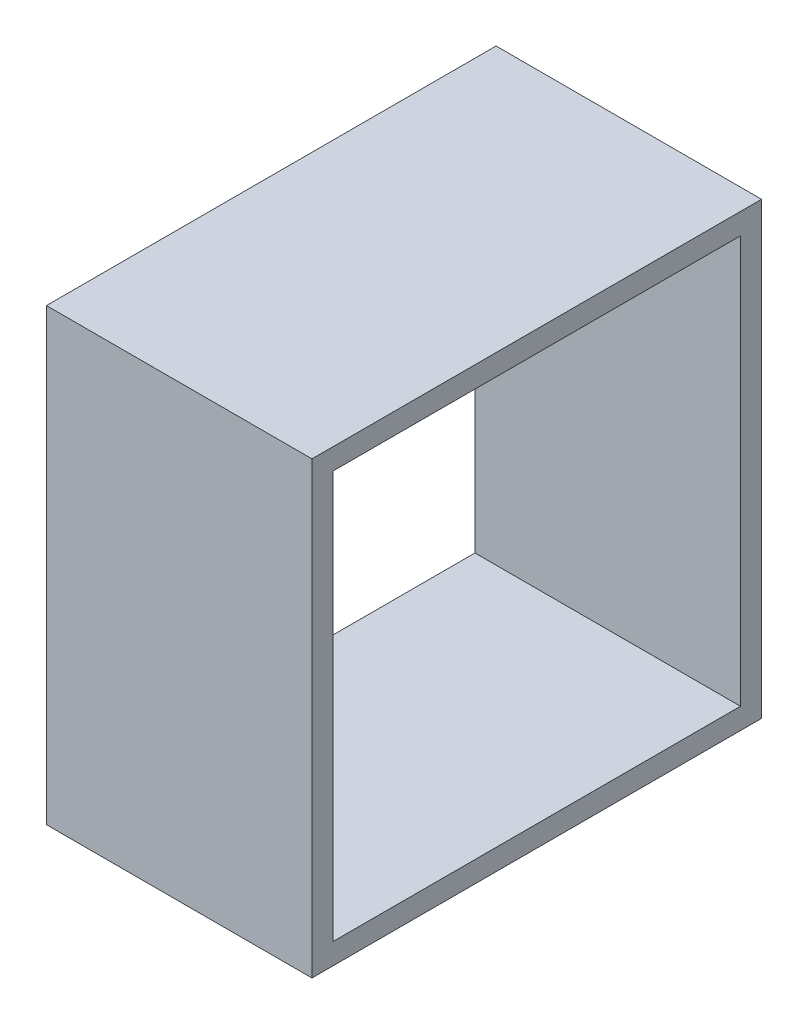
ISO-10303-21;
HEADER;
FILE_DESCRIPTION(('STEP AP214'),'2;1');
FILE_NAME('part.step','',(''),(''),'','','');
FILE_SCHEMA(('AUTOMOTIVE_DESIGN { 1 0 10303 214 1 1 1 1 }'));
ENDSEC;
DATA;
#1=APPLICATION_CONTEXT('core data for automotive mechanical design processes');
#2=APPLICATION_PROTOCOL_DEFINITION('international standard','automotive_design',2000,#1);
#3=PRODUCT_CONTEXT('',#1,'mechanical');
#4=PRODUCT('Part','Part','',(#3));
#5=PRODUCT_RELATED_PRODUCT_CATEGORY('part','',(#4));
#6=PRODUCT_DEFINITION_FORMATION('','',#4);
#7=PRODUCT_DEFINITION_CONTEXT('part definition',#1,'design');
#8=PRODUCT_DEFINITION('design','',#6,#7);
#9=PRODUCT_DEFINITION_SHAPE('','',#8);
#10=(LENGTH_UNIT() NAMED_UNIT(*) SI_UNIT(.MILLI.,.METRE.));
#11=(NAMED_UNIT(*) PLANE_ANGLE_UNIT() SI_UNIT($,.RADIAN.));
#12=(NAMED_UNIT(*) SI_UNIT($,.STERADIAN.) SOLID_ANGLE_UNIT());
#13=UNCERTAINTY_MEASURE_WITH_UNIT(LENGTH_MEASURE(1.E-05),#10,'distance_accuracy_value','');
#14=(GEOMETRIC_REPRESENTATION_CONTEXT(3) GLOBAL_UNCERTAINTY_ASSIGNED_CONTEXT((#13)) GLOBAL_UNIT_ASSIGNED_CONTEXT((#10,
#11,#12)) REPRESENTATION_CONTEXT('',''));
#15=CARTESIAN_POINT('',(0.,0.,0.));
#16=DIRECTION('',(0.,0.,1.));
#17=DIRECTION('',(1.,0.,0.));
#18=AXIS2_PLACEMENT_3D('',#15,#16,#17);
#19=CARTESIAN_POINT('',(60.,50.8,50.8));
#20=DIRECTION('',(0.,-1.,0.));
#21=DIRECTION('',(0.,0.,-1.));
#22=AXIS2_PLACEMENT_3D('',#19,#20,#21);
#23=PLANE('',#22);
#24=DIRECTION('',(0.,0.,1.));
#25=VECTOR('',#24,1.);
#26=CARTESIAN_POINT('',(0.,50.8,50.8));
#27=LINE('',#26,#25);
#28=CARTESIAN_POINT('',(0.,50.8,-50.8));
#29=VERTEX_POINT('',#28);
#30=CARTESIAN_POINT('',(0.,50.8,50.8));
#31=VERTEX_POINT('',#30);
#32=EDGE_CURVE('E152',#29,#31,#27,.T.);
#33=ORIENTED_EDGE('',*,*,#32,.T.);
#34=DIRECTION('',(-1.,0.,0.));
#35=VECTOR('',#34,1.);
#36=CARTESIAN_POINT('',(60.,50.8,50.8));
#37=LINE('',#36,#35);
#38=CARTESIAN_POINT('',(60.,50.8,50.8));
#39=VERTEX_POINT('',#38);
#40=EDGE_CURVE('E11',#39,#31,#37,.T.);
#41=ORIENTED_EDGE('',*,*,#40,.F.);
#42=DIRECTION('',(0.,0.,1.));
#43=VECTOR('',#42,1.);
#44=CARTESIAN_POINT('',(60.,50.8,50.8));
#45=LINE('',#44,#43);
#46=CARTESIAN_POINT('',(60.,50.8,-50.8));
#47=VERTEX_POINT('',#46);
#48=EDGE_CURVE('E126',#47,#39,#45,.T.);
#49=ORIENTED_EDGE('',*,*,#48,.F.);
#50=DIRECTION('',(-1.,0.,0.));
#51=VECTOR('',#50,1.);
#52=CARTESIAN_POINT('',(60.,50.8,-50.8));
#53=LINE('',#52,#51);
#54=EDGE_CURVE('E161',#47,#29,#53,.T.);
#55=ORIENTED_EDGE('',*,*,#54,.T.);
#56=EDGE_LOOP('',(#33,#41,#49,#55));
#57=FACE_BOUND('',#56,.T.);
#58=ADVANCED_FACE('F50',(#57),#23,.F.);
#59=CARTESIAN_POINT('',(60.,50.8,50.8));
#60=DIRECTION('',(0.,0.,-1.));
#61=DIRECTION('',(-1.,0.,0.));
#62=AXIS2_PLACEMENT_3D('',#59,#60,#61);
#63=PLANE('',#62);
#64=DIRECTION('',(0.,-1.,0.));
#65=VECTOR('',#64,1.);
#66=CARTESIAN_POINT('',(0.,50.8,50.8));
#67=LINE('',#66,#65);
#68=CARTESIAN_POINT('',(0.,-50.8,50.8));
#69=VERTEX_POINT('',#68);
#70=EDGE_CURVE('E132',#31,#69,#67,.T.);
#71=ORIENTED_EDGE('',*,*,#70,.T.);
#72=DIRECTION('',(-1.,0.,0.));
#73=VECTOR('',#72,1.);
#74=CARTESIAN_POINT('',(60.,-50.8,50.8));
#75=LINE('',#74,#73);
#76=CARTESIAN_POINT('',(60.,-50.8,50.8));
#77=VERTEX_POINT('',#76);
#78=EDGE_CURVE('E60',#77,#69,#75,.T.);
#79=ORIENTED_EDGE('',*,*,#78,.F.);
#80=DIRECTION('',(0.,-1.,0.));
#81=VECTOR('',#80,1.);
#82=CARTESIAN_POINT('',(60.,50.8,50.8));
#83=LINE('',#82,#81);
#84=EDGE_CURVE('E125',#39,#77,#83,.T.);
#85=ORIENTED_EDGE('',*,*,#84,.F.);
#86=ORIENTED_EDGE('',*,*,#40,.T.);
#87=EDGE_LOOP('',(#71,#79,#85,#86));
#88=FACE_BOUND('',#87,.T.);
#89=ADVANCED_FACE('F134',(#88),#63,.F.);
#90=CARTESIAN_POINT('',(60.,-50.8,-50.8));
#91=DIRECTION('',(0.,1.,0.));
#92=DIRECTION('',(0.,0.,1.));
#93=AXIS2_PLACEMENT_3D('',#90,#91,#92);
#94=PLANE('',#93);
#95=DIRECTION('',(0.,0.,-1.));
#96=VECTOR('',#95,1.);
#97=CARTESIAN_POINT('',(0.,-50.8,-50.8));
#98=LINE('',#97,#96);
#99=CARTESIAN_POINT('',(0.,-50.8,-50.8));
#100=VERTEX_POINT('',#99);
#101=EDGE_CURVE('E92',#69,#100,#98,.T.);
#102=ORIENTED_EDGE('',*,*,#101,.T.);
#103=DIRECTION('',(-1.,0.,0.));
#104=VECTOR('',#103,1.);
#105=CARTESIAN_POINT('',(60.,-50.8,-50.8));
#106=LINE('',#105,#104);
#107=CARTESIAN_POINT('',(60.,-50.8,-50.8));
#108=VERTEX_POINT('',#107);
#109=EDGE_CURVE('E135',#108,#100,#106,.T.);
#110=ORIENTED_EDGE('',*,*,#109,.F.);
#111=DIRECTION('',(0.,0.,-1.));
#112=VECTOR('',#111,1.);
#113=CARTESIAN_POINT('',(60.,-50.8,-50.8));
#114=LINE('',#113,#112);
#115=EDGE_CURVE('E127',#77,#108,#114,.T.);
#116=ORIENTED_EDGE('',*,*,#115,.F.);
#117=ORIENTED_EDGE('',*,*,#78,.T.);
#118=EDGE_LOOP('',(#102,#110,#116,#117));
#119=FACE_BOUND('',#118,.T.);
#120=ADVANCED_FACE('F137',(#119),#94,.F.);
#121=CARTESIAN_POINT('',(60.,46.0375,46.0375));
#122=DIRECTION('',(0.,0.,-1.));
#123=DIRECTION('',(-1.,0.,0.));
#124=AXIS2_PLACEMENT_3D('',#121,#122,#123);
#125=PLANE('',#124);
#126=DIRECTION('',(0.,-1.,0.));
#127=VECTOR('',#126,1.);
#128=CARTESIAN_POINT('',(0.,46.0375,46.0375));
#129=LINE('',#128,#127);
#130=CARTESIAN_POINT('',(0.,46.0375,46.0375));
#131=VERTEX_POINT('',#130);
#132=CARTESIAN_POINT('',(0.,-46.0375,46.0375));
#133=VERTEX_POINT('',#132);
#134=EDGE_CURVE('E142',#131,#133,#129,.T.);
#135=ORIENTED_EDGE('',*,*,#134,.F.);
#136=DIRECTION('',(-1.,0.,0.));
#137=VECTOR('',#136,1.);
#138=CARTESIAN_POINT('',(60.,46.0375,46.0375));
#139=LINE('',#138,#137);
#140=CARTESIAN_POINT('',(60.,46.0375,46.0375));
#141=VERTEX_POINT('',#140);
#142=EDGE_CURVE('E51',#141,#131,#139,.T.);
#143=ORIENTED_EDGE('',*,*,#142,.F.);
#144=DIRECTION('',(0.,-1.,0.));
#145=VECTOR('',#144,1.);
#146=CARTESIAN_POINT('',(60.,46.0375,46.0375));
#147=LINE('',#146,#145);
#148=CARTESIAN_POINT('',(60.,-46.0375,46.0375));
#149=VERTEX_POINT('',#148);
#150=EDGE_CURVE('E159',#141,#149,#147,.T.);
#151=ORIENTED_EDGE('',*,*,#150,.T.);
#152=DIRECTION('',(-1.,0.,0.));
#153=VECTOR('',#152,1.);
#154=CARTESIAN_POINT('',(60.,-46.0375,46.0375));
#155=LINE('',#154,#153);
#156=EDGE_CURVE('E139',#149,#133,#155,.T.);
#157=ORIENTED_EDGE('',*,*,#156,.T.);
#158=EDGE_LOOP('',(#135,#143,#151,#157));
#159=FACE_BOUND('',#158,.T.);
#160=ADVANCED_FACE('F47',(#159),#125,.T.);
#161=CARTESIAN_POINT('',(60.,46.0375,46.0375));
#162=DIRECTION('',(0.,-1.,0.));
#163=DIRECTION('',(0.,0.,-1.));
#164=AXIS2_PLACEMENT_3D('',#161,#162,#163);
#165=PLANE('',#164);
#166=DIRECTION('',(0.,0.,1.));
#167=VECTOR('',#166,1.);
#168=CARTESIAN_POINT('',(0.,46.0375,46.0375));
#169=LINE('',#168,#167);
#170=CARTESIAN_POINT('',(0.,46.0375,-46.0375));
#171=VERTEX_POINT('',#170);
#172=EDGE_CURVE('E144',#171,#131,#169,.T.);
#173=ORIENTED_EDGE('',*,*,#172,.F.);
#174=DIRECTION('',(-1.,0.,0.));
#175=VECTOR('',#174,1.);
#176=CARTESIAN_POINT('',(60.,46.0375,-46.0375));
#177=LINE('',#176,#175);
#178=CARTESIAN_POINT('',(60.,46.0375,-46.0375));
#179=VERTEX_POINT('',#178);
#180=EDGE_CURVE('E167',#179,#171,#177,.T.);
#181=ORIENTED_EDGE('',*,*,#180,.F.);
#182=DIRECTION('',(0.,0.,1.));
#183=VECTOR('',#182,1.);
#184=CARTESIAN_POINT('',(60.,46.0375,46.0375));
#185=LINE('',#184,#183);
#186=EDGE_CURVE('E171',#179,#141,#185,.T.);
#187=ORIENTED_EDGE('',*,*,#186,.T.);
#188=ORIENTED_EDGE('',*,*,#142,.T.);
#189=EDGE_LOOP('',(#173,#181,#187,#188));
#190=FACE_BOUND('',#189,.T.);
#191=ADVANCED_FACE('F172',(#190),#165,.T.);
#192=CARTESIAN_POINT('',(60.,-46.0375,-46.0375));
#193=DIRECTION('',(0.,0.,1.));
#194=DIRECTION('',(1.,0.,0.));
#195=AXIS2_PLACEMENT_3D('',#192,#193,#194);
#196=PLANE('',#195);
#197=DIRECTION('',(0.,1.,0.));
#198=VECTOR('',#197,1.);
#199=CARTESIAN_POINT('',(0.,-46.0375,-46.0375));
#200=LINE('',#199,#198);
#201=CARTESIAN_POINT('',(0.,-46.0375,-46.0375));
#202=VERTEX_POINT('',#201);
#203=EDGE_CURVE('E146',#202,#171,#200,.T.);
#204=ORIENTED_EDGE('',*,*,#203,.F.);
#205=DIRECTION('',(-1.,0.,0.));
#206=VECTOR('',#205,1.);
#207=CARTESIAN_POINT('',(60.,-46.0375,-46.0375));
#208=LINE('',#207,#206);
#209=CARTESIAN_POINT('',(60.,-46.0375,-46.0375));
#210=VERTEX_POINT('',#209);
#211=EDGE_CURVE('E164',#210,#202,#208,.T.);
#212=ORIENTED_EDGE('',*,*,#211,.F.);
#213=DIRECTION('',(0.,1.,0.));
#214=VECTOR('',#213,1.);
#215=CARTESIAN_POINT('',(60.,-46.0375,-46.0375));
#216=LINE('',#215,#214);
#217=EDGE_CURVE('E185',#210,#179,#216,.T.);
#218=ORIENTED_EDGE('',*,*,#217,.T.);
#219=ORIENTED_EDGE('',*,*,#180,.T.);
#220=EDGE_LOOP('',(#204,#212,#218,#219));
#221=FACE_BOUND('',#220,.T.);
#222=ADVANCED_FACE('F178',(#221),#196,.T.);
#223=CARTESIAN_POINT('',(60.,-46.0375,-46.0375));
#224=DIRECTION('',(0.,1.,0.));
#225=DIRECTION('',(0.,0.,1.));
#226=AXIS2_PLACEMENT_3D('',#223,#224,#225);
#227=PLANE('',#226);
#228=DIRECTION('',(0.,0.,-1.));
#229=VECTOR('',#228,1.);
#230=CARTESIAN_POINT('',(0.,-46.0375,-46.0375));
#231=LINE('',#230,#229);
#232=EDGE_CURVE('E151',#133,#202,#231,.T.);
#233=ORIENTED_EDGE('',*,*,#232,.F.);
#234=ORIENTED_EDGE('',*,*,#156,.F.);
#235=DIRECTION('',(0.,0.,-1.));
#236=VECTOR('',#235,1.);
#237=CARTESIAN_POINT('',(60.,-46.0375,-46.0375));
#238=LINE('',#237,#236);
#239=EDGE_CURVE('E189',#149,#210,#238,.T.);
#240=ORIENTED_EDGE('',*,*,#239,.T.);
#241=ORIENTED_EDGE('',*,*,#211,.T.);
#242=EDGE_LOOP('',(#233,#234,#240,#241));
#243=FACE_BOUND('',#242,.T.);
#244=ADVANCED_FACE('F190',(#243),#227,.T.);
#245=CARTESIAN_POINT('',(60.,-50.8,-50.8));
#246=DIRECTION('',(0.,0.,1.));
#247=DIRECTION('',(0.,-1.,0.));
#248=AXIS2_PLACEMENT_3D('',#245,#246,#247);
#249=PLANE('',#248);
#250=DIRECTION('',(0.,1.,0.));
#251=VECTOR('',#250,1.);
#252=CARTESIAN_POINT('',(0.,-50.8,-50.8));
#253=LINE('',#252,#251);
#254=EDGE_CURVE('E101',#100,#29,#253,.T.);
#255=ORIENTED_EDGE('',*,*,#254,.T.);
#256=ORIENTED_EDGE('',*,*,#54,.F.);
#257=DIRECTION('',(0.,1.,0.));
#258=VECTOR('',#257,1.);
#259=CARTESIAN_POINT('',(60.,-50.8,-50.8));
#260=LINE('',#259,#258);
#261=EDGE_CURVE('E67',#108,#47,#260,.T.);
#262=ORIENTED_EDGE('',*,*,#261,.F.);
#263=ORIENTED_EDGE('',*,*,#109,.T.);
#264=EDGE_LOOP('',(#255,#256,#262,#263));
#265=FACE_BOUND('',#264,.T.);
#266=ADVANCED_FACE('F191',(#265),#249,.F.);
#267=CARTESIAN_POINT('',(60.,0.,0.));
#268=DIRECTION('',(1.,0.,0.));
#269=DIRECTION('',(0.,0.,-1.));
#270=AXIS2_PLACEMENT_3D('',#267,#268,#269);
#271=PLANE('',#270);
#272=ORIENTED_EDGE('',*,*,#150,.F.);
#273=ORIENTED_EDGE('',*,*,#186,.F.);
#274=ORIENTED_EDGE('',*,*,#217,.F.);
#275=ORIENTED_EDGE('',*,*,#239,.F.);
#276=EDGE_LOOP('',(#272,#273,#274,#275));
#277=FACE_BOUND('',#276,.T.);
#278=ORIENTED_EDGE('',*,*,#48,.T.);
#279=ORIENTED_EDGE('',*,*,#84,.T.);
#280=ORIENTED_EDGE('',*,*,#115,.T.);
#281=ORIENTED_EDGE('',*,*,#261,.T.);
#282=EDGE_LOOP('',(#278,#279,#280,#281));
#283=FACE_BOUND('',#282,.T.);
#284=ADVANCED_FACE('F121',(#277,#283),#271,.T.);
#285=CARTESIAN_POINT('',(0.,0.,0.));
#286=DIRECTION('',(1.,0.,0.));
#287=DIRECTION('',(0.,0.,-1.));
#288=AXIS2_PLACEMENT_3D('',#285,#286,#287);
#289=PLANE('',#288);
#290=ORIENTED_EDGE('',*,*,#134,.T.);
#291=ORIENTED_EDGE('',*,*,#232,.T.);
#292=ORIENTED_EDGE('',*,*,#203,.T.);
#293=ORIENTED_EDGE('',*,*,#172,.T.);
#294=EDGE_LOOP('',(#290,#291,#292,#293));
#295=FACE_BOUND('',#294,.T.);
#296=ORIENTED_EDGE('',*,*,#32,.F.);
#297=ORIENTED_EDGE('',*,*,#254,.F.);
#298=ORIENTED_EDGE('',*,*,#101,.F.);
#299=ORIENTED_EDGE('',*,*,#70,.F.);
#300=EDGE_LOOP('',(#296,#297,#298,#299));
#301=FACE_BOUND('',#300,.T.);
#302=ADVANCED_FACE('F179',(#295,#301),#289,.F.);
#303=CLOSED_SHELL('',(#58,#89,#120,#160,#191,#222,#244,#266,#284,#302));
#304=MANIFOLD_SOLID_BREP('B2',#303);
#305=ADVANCED_BREP_SHAPE_REPRESENTATION('',(#18,#304),#14);
#306=SHAPE_DEFINITION_REPRESENTATION(#9,#305);
ENDSEC;
END-ISO-10303-21;
